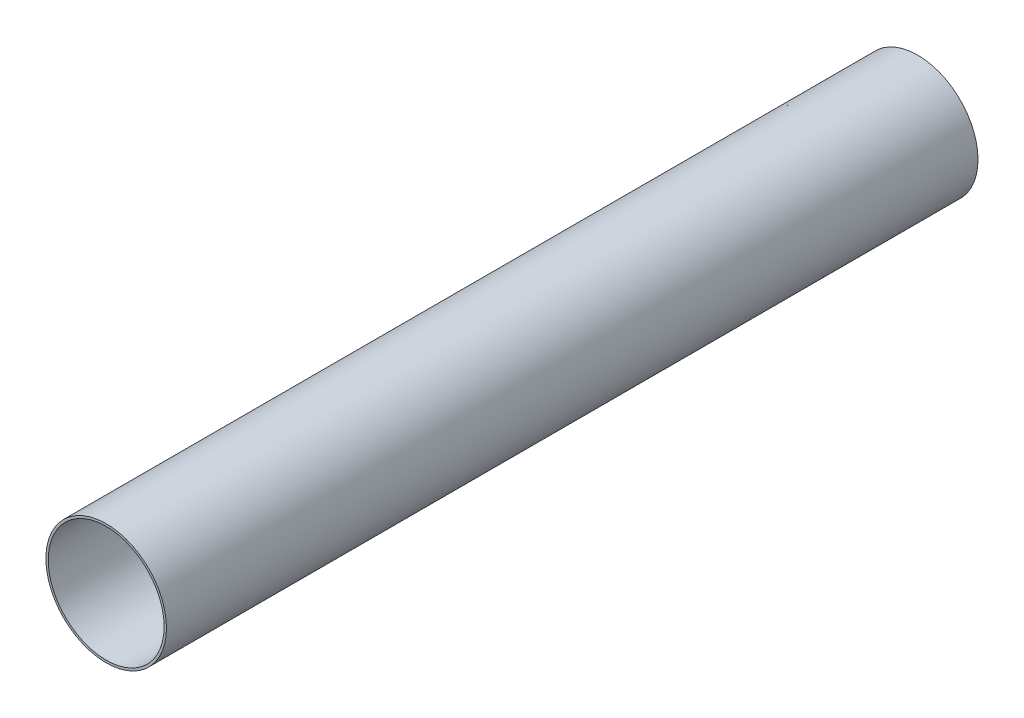
ISO-10303-21;
HEADER;
FILE_DESCRIPTION(('STEP AP214'),'2;1');
FILE_NAME('part.step','',(''),(''),'','','');
FILE_SCHEMA(('AUTOMOTIVE_DESIGN { 1 0 10303 214 1 1 1 1 }'));
ENDSEC;
DATA;
#1=APPLICATION_CONTEXT('core data for automotive mechanical design processes');
#2=APPLICATION_PROTOCOL_DEFINITION('international standard','automotive_design',2000,#1);
#3=PRODUCT_CONTEXT('',#1,'mechanical');
#4=PRODUCT('Part','Part','',(#3));
#5=PRODUCT_RELATED_PRODUCT_CATEGORY('part','',(#4));
#6=PRODUCT_DEFINITION_FORMATION('','',#4);
#7=PRODUCT_DEFINITION_CONTEXT('part definition',#1,'design');
#8=PRODUCT_DEFINITION('design','',#6,#7);
#9=PRODUCT_DEFINITION_SHAPE('','',#8);
#10=(LENGTH_UNIT() NAMED_UNIT(*) SI_UNIT(.MILLI.,.METRE.));
#11=(NAMED_UNIT(*) PLANE_ANGLE_UNIT() SI_UNIT($,.RADIAN.));
#12=(NAMED_UNIT(*) SI_UNIT($,.STERADIAN.) SOLID_ANGLE_UNIT());
#13=UNCERTAINTY_MEASURE_WITH_UNIT(LENGTH_MEASURE(1.E-05),#10,'distance_accuracy_value','');
#14=(GEOMETRIC_REPRESENTATION_CONTEXT(3) GLOBAL_UNCERTAINTY_ASSIGNED_CONTEXT((#13)) GLOBAL_UNIT_ASSIGNED_CONTEXT((#10,
#11,#12)) REPRESENTATION_CONTEXT('',''));
#15=CARTESIAN_POINT('',(0.,0.,0.));
#16=DIRECTION('',(0.,0.,1.));
#17=DIRECTION('',(1.,0.,0.));
#18=AXIS2_PLACEMENT_3D('',#15,#16,#17);
#19=CARTESIAN_POINT('',(2.71657696337968E-12,0.,-1270.6173157302));
#20=DIRECTION('',(0.,0.,1.));
#21=DIRECTION('',(1.,0.,0.));
#22=AXIS2_PLACEMENT_3D('',#19,#20,#21);
#23=CYLINDRICAL_SURFACE('',#22,77.9999999999991);
#24=CARTESIAN_POINT('',(2.71657696337968E-12,0.,0.));
#25=DIRECTION('',(0.,0.,1.));
#26=DIRECTION('',(1.,0.,0.));
#27=AXIS2_PLACEMENT_3D('',#24,#25,#26);
#28=CIRCLE('',#27,77.9999999999991);
#29=CARTESIAN_POINT('',(78.0000000000018,0.,0.));
#30=VERTEX_POINT('',#29);
#31=EDGE_CURVE('E38',#30,#30,#28,.T.);
#32=ORIENTED_EDGE('',*,*,#31,.F.);
#33=EDGE_LOOP('',(#32));
#34=FACE_BOUND('',#33,.T.);
#35=CARTESIAN_POINT('',(2.71657696337968E-12,0.,-1050.));
#36=DIRECTION('',(0.,0.,-1.));
#37=DIRECTION('',(-1.,0.,0.));
#38=AXIS2_PLACEMENT_3D('',#35,#36,#37);
#39=CIRCLE('',#38,77.9999999999991);
#40=CARTESIAN_POINT('',(-77.9999999999964,0.,-1050.));
#41=VERTEX_POINT('',#40);
#42=EDGE_CURVE('E47',#41,#41,#39,.F.);
#43=ORIENTED_EDGE('',*,*,#42,.T.);
#44=EDGE_LOOP('',(#43));
#45=FACE_BOUND('',#44,.T.);
#46=ADVANCED_FACE('F31',(#34,#45),#23,.T.);
#47=CARTESIAN_POINT('',(2.71657696337968E-12,0.,-1270.6173157302));
#48=DIRECTION('',(0.,0.,1.));
#49=DIRECTION('',(1.,0.,0.));
#50=AXIS2_PLACEMENT_3D('',#47,#48,#49);
#51=CYLINDRICAL_SURFACE('',#50,74.9999999999991);
#52=CARTESIAN_POINT('',(2.71657696337968E-12,0.,0.));
#53=DIRECTION('',(0.,0.,1.));
#54=DIRECTION('',(1.,0.,0.));
#55=AXIS2_PLACEMENT_3D('',#52,#53,#54);
#56=CIRCLE('',#55,74.9999999999991);
#57=CARTESIAN_POINT('',(75.0000000000018,0.,0.));
#58=VERTEX_POINT('',#57);
#59=EDGE_CURVE('E42',#58,#58,#56,.T.);
#60=ORIENTED_EDGE('',*,*,#59,.T.);
#61=EDGE_LOOP('',(#60));
#62=FACE_BOUND('',#61,.T.);
#63=CARTESIAN_POINT('',(2.71657696337968E-12,0.,-1050.));
#64=DIRECTION('',(0.,0.,-1.));
#65=DIRECTION('',(-1.,0.,0.));
#66=AXIS2_PLACEMENT_3D('',#63,#64,#65);
#67=CIRCLE('',#66,74.9999999999991);
#68=CARTESIAN_POINT('',(-74.9999999999964,0.,-1050.));
#69=VERTEX_POINT('',#68);
#70=EDGE_CURVE('E10',#69,#69,#67,.F.);
#71=ORIENTED_EDGE('',*,*,#70,.F.);
#72=EDGE_LOOP('',(#71));
#73=FACE_BOUND('',#72,.T.);
#74=ADVANCED_FACE('F58',(#62,#73),#51,.F.);
#75=CARTESIAN_POINT('',(2.71657696337968E-12,0.,0.));
#76=DIRECTION('',(0.,0.,1.));
#77=DIRECTION('',(1.,0.,0.));
#78=AXIS2_PLACEMENT_3D('',#75,#76,#77);
#79=PLANE('',#78);
#80=ORIENTED_EDGE('',*,*,#59,.F.);
#81=EDGE_LOOP('',(#80));
#82=FACE_BOUND('',#81,.T.);
#83=ORIENTED_EDGE('',*,*,#31,.T.);
#84=EDGE_LOOP('',(#83));
#85=FACE_BOUND('',#84,.T.);
#86=ADVANCED_FACE('F54',(#82,#85),#79,.T.);
#87=CARTESIAN_POINT('',(-29.6984848098394,-29.698484809835,-1050.));
#88=DIRECTION('',(0.,0.,-1.));
#89=DIRECTION('',(-1.,0.,0.));
#90=AXIS2_PLACEMENT_3D('',#87,#88,#89);
#91=PLANE('',#90);
#92=ORIENTED_EDGE('',*,*,#42,.F.);
#93=EDGE_LOOP('',(#92));
#94=FACE_BOUND('',#93,.T.);
#95=ORIENTED_EDGE('',*,*,#70,.T.);
#96=EDGE_LOOP('',(#95));
#97=FACE_BOUND('',#96,.T.);
#98=ADVANCED_FACE('F33',(#94,#97),#91,.T.);
#99=CLOSED_SHELL('',(#46,#74,#86,#98));
#100=MANIFOLD_SOLID_BREP('B2',#99);
#101=ADVANCED_BREP_SHAPE_REPRESENTATION('',(#18,#100),#14);
#102=SHAPE_DEFINITION_REPRESENTATION(#9,#101);
ENDSEC;
END-ISO-10303-21;
